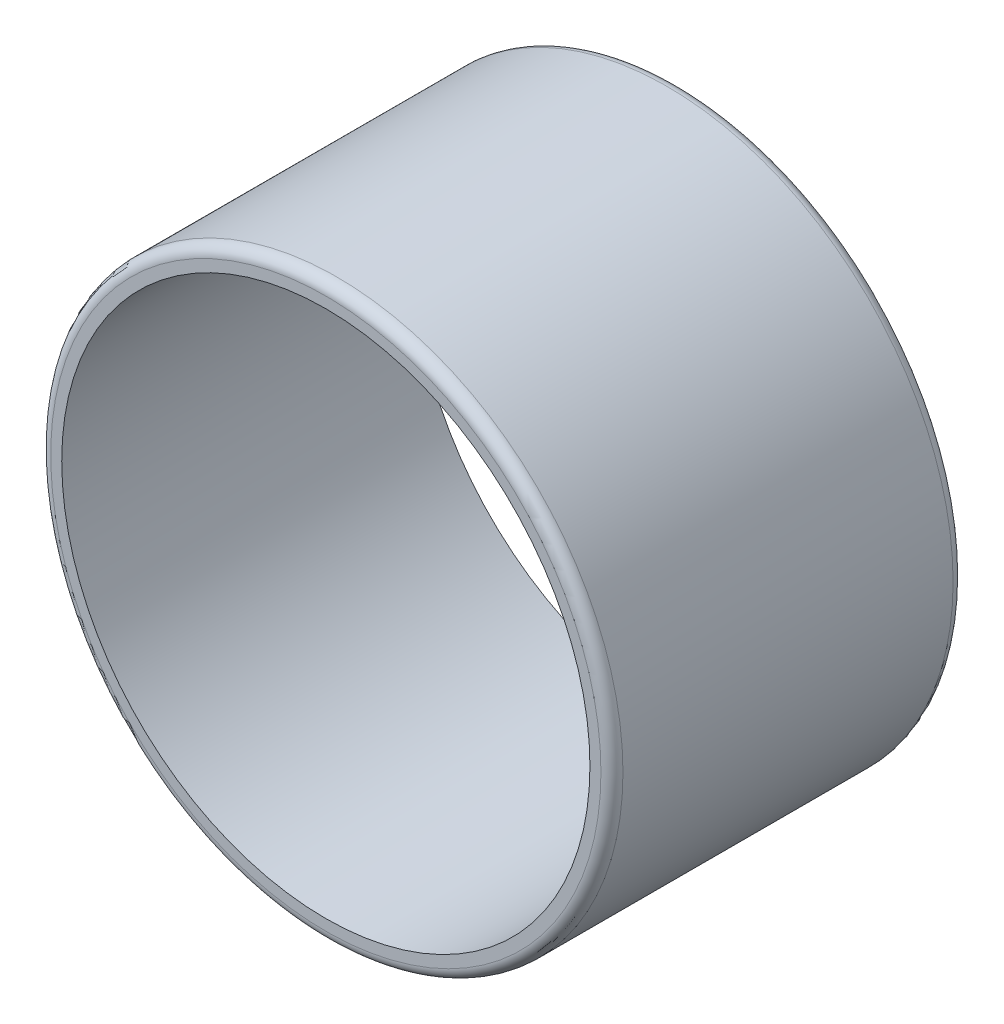
ISO-10303-21;
HEADER;
FILE_DESCRIPTION(('STEP AP214'),'2;1');
FILE_NAME('part.step','',(''),(''),'','','');
FILE_SCHEMA(('AUTOMOTIVE_DESIGN { 1 0 10303 214 1 1 1 1 }'));
ENDSEC;
DATA;
#1=APPLICATION_CONTEXT('core data for automotive mechanical design processes');
#2=APPLICATION_PROTOCOL_DEFINITION('international standard','automotive_design',2000,#1);
#3=PRODUCT_CONTEXT('',#1,'mechanical');
#4=PRODUCT('Part','Part','',(#3));
#5=PRODUCT_RELATED_PRODUCT_CATEGORY('part','',(#4));
#6=PRODUCT_DEFINITION_FORMATION('','',#4);
#7=PRODUCT_DEFINITION_CONTEXT('part definition',#1,'design');
#8=PRODUCT_DEFINITION('design','',#6,#7);
#9=PRODUCT_DEFINITION_SHAPE('','',#8);
#10=(LENGTH_UNIT() NAMED_UNIT(*) SI_UNIT(.MILLI.,.METRE.));
#11=(NAMED_UNIT(*) PLANE_ANGLE_UNIT() SI_UNIT($,.RADIAN.));
#12=(NAMED_UNIT(*) SI_UNIT($,.STERADIAN.) SOLID_ANGLE_UNIT());
#13=UNCERTAINTY_MEASURE_WITH_UNIT(LENGTH_MEASURE(1.E-05),#10,'distance_accuracy_value','');
#14=(GEOMETRIC_REPRESENTATION_CONTEXT(3) GLOBAL_UNCERTAINTY_ASSIGNED_CONTEXT((#13)) GLOBAL_UNIT_ASSIGNED_CONTEXT((#10,
#11,#12)) REPRESENTATION_CONTEXT('',''));
#15=CARTESIAN_POINT('',(0.,0.,0.));
#16=DIRECTION('',(0.,0.,1.));
#17=DIRECTION('',(1.,0.,0.));
#18=AXIS2_PLACEMENT_3D('',#15,#16,#17);
#19=CARTESIAN_POINT('',(0.,0.,8.));
#20=DIRECTION('',(0.,0.,1.));
#21=DIRECTION('',(1.,0.,0.));
#22=AXIS2_PLACEMENT_3D('',#19,#20,#21);
#23=PLANE('',#22);
#24=CARTESIAN_POINT('',(0.,0.,8.));
#25=DIRECTION('',(0.,0.,1.));
#26=DIRECTION('',(1.,0.,0.));
#27=AXIS2_PLACEMENT_3D('',#24,#25,#26);
#28=CIRCLE('',#27,12.5);
#29=CARTESIAN_POINT('',(12.5,0.,8.));
#30=VERTEX_POINT('',#29);
#31=EDGE_CURVE('E10',#30,#30,#28,.T.);
#32=ORIENTED_EDGE('',*,*,#31,.T.);
#33=EDGE_LOOP('',(#32));
#34=FACE_BOUND('',#33,.T.);
#35=CARTESIAN_POINT('',(0.,0.,8.));
#36=DIRECTION('',(0.,0.,1.));
#37=DIRECTION('',(1.,0.,0.));
#38=AXIS2_PLACEMENT_3D('',#35,#36,#37);
#39=CIRCLE('',#38,12.);
#40=CARTESIAN_POINT('',(12.,0.,8.));
#41=VERTEX_POINT('',#40);
#42=EDGE_CURVE('E51',#41,#41,#39,.T.);
#43=ORIENTED_EDGE('',*,*,#42,.F.);
#44=EDGE_LOOP('',(#43));
#45=FACE_BOUND('',#44,.T.);
#46=ADVANCED_FACE('F31',(#34,#45),#23,.T.);
#47=CARTESIAN_POINT('',(0.,0.,-8.));
#48=DIRECTION('',(0.,0.,1.));
#49=DIRECTION('',(1.,0.,0.));
#50=AXIS2_PLACEMENT_3D('',#47,#48,#49);
#51=PLANE('',#50);
#52=CARTESIAN_POINT('',(0.,0.,-8.));
#53=DIRECTION('',(0.,0.,1.));
#54=DIRECTION('',(1.,0.,0.));
#55=AXIS2_PLACEMENT_3D('',#52,#53,#54);
#56=CIRCLE('',#55,12.5);
#57=CARTESIAN_POINT('',(12.5,0.,-8.));
#58=VERTEX_POINT('',#57);
#59=EDGE_CURVE('E38',#58,#58,#56,.F.);
#60=ORIENTED_EDGE('',*,*,#59,.T.);
#61=EDGE_LOOP('',(#60));
#62=FACE_BOUND('',#61,.T.);
#63=CARTESIAN_POINT('',(0.,0.,-8.));
#64=DIRECTION('',(0.,0.,1.));
#65=DIRECTION('',(1.,0.,0.));
#66=AXIS2_PLACEMENT_3D('',#63,#64,#65);
#67=CIRCLE('',#66,12.);
#68=CARTESIAN_POINT('',(12.,0.,-8.));
#69=VERTEX_POINT('',#68);
#70=EDGE_CURVE('E52',#69,#69,#67,.T.);
#71=ORIENTED_EDGE('',*,*,#70,.T.);
#72=EDGE_LOOP('',(#71));
#73=FACE_BOUND('',#72,.T.);
#74=ADVANCED_FACE('F62',(#62,#73),#51,.F.);
#75=CARTESIAN_POINT('',(0.,0.,8.));
#76=DIRECTION('',(0.,0.,-1.));
#77=DIRECTION('',(-1.,0.,0.));
#78=AXIS2_PLACEMENT_3D('',#75,#76,#77);
#79=CYLINDRICAL_SURFACE('',#78,13.);
#80=CARTESIAN_POINT('',(0.,0.,-7.5));
#81=DIRECTION('',(0.,0.,1.));
#82=DIRECTION('',(1.,0.,0.));
#83=AXIS2_PLACEMENT_3D('',#80,#81,#82);
#84=CIRCLE('',#83,13.);
#85=CARTESIAN_POINT('',(13.,0.,-7.5));
#86=VERTEX_POINT('',#85);
#87=EDGE_CURVE('E42',#86,#86,#84,.T.);
#88=ORIENTED_EDGE('',*,*,#87,.T.);
#89=EDGE_LOOP('',(#88));
#90=FACE_BOUND('',#89,.T.);
#91=CARTESIAN_POINT('',(0.,0.,7.5));
#92=DIRECTION('',(0.,0.,1.));
#93=DIRECTION('',(1.,0.,0.));
#94=AXIS2_PLACEMENT_3D('',#91,#92,#93);
#95=CIRCLE('',#94,13.);
#96=CARTESIAN_POINT('',(13.,0.,7.5));
#97=VERTEX_POINT('',#96);
#98=EDGE_CURVE('E46',#97,#97,#95,.F.);
#99=ORIENTED_EDGE('',*,*,#98,.T.);
#100=EDGE_LOOP('',(#99));
#101=FACE_BOUND('',#100,.T.);
#102=ADVANCED_FACE('F67',(#90,#101),#79,.T.);
#103=CARTESIAN_POINT('',(0.,0.,8.));
#104=DIRECTION('',(0.,0.,-1.));
#105=DIRECTION('',(-1.,0.,0.));
#106=AXIS2_PLACEMENT_3D('',#103,#104,#105);
#107=CYLINDRICAL_SURFACE('',#106,12.);
#108=ORIENTED_EDGE('',*,*,#42,.T.);
#109=EDGE_LOOP('',(#108));
#110=FACE_BOUND('',#109,.T.);
#111=ORIENTED_EDGE('',*,*,#70,.F.);
#112=EDGE_LOOP('',(#111));
#113=FACE_BOUND('',#112,.T.);
#114=ADVANCED_FACE('F58',(#110,#113),#107,.F.);
#115=CARTESIAN_POINT('',(0.,0.,-7.5));
#116=DIRECTION('',(0.,0.,1.));
#117=DIRECTION('',(1.,0.,0.));
#118=AXIS2_PLACEMENT_3D('',#115,#116,#117);
#119=TOROIDAL_SURFACE('',#118,12.5,0.5);
#120=ORIENTED_EDGE('',*,*,#59,.F.);
#121=EDGE_LOOP('',(#120));
#122=FACE_BOUND('',#121,.T.);
#123=ORIENTED_EDGE('',*,*,#87,.F.);
#124=EDGE_LOOP('',(#123));
#125=FACE_BOUND('',#124,.T.);
#126=ADVANCED_FACE('F73',(#122,#125),#119,.T.);
#127=CARTESIAN_POINT('',(0.,0.,7.5));
#128=DIRECTION('',(0.,0.,1.));
#129=DIRECTION('',(1.,0.,0.));
#130=AXIS2_PLACEMENT_3D('',#127,#128,#129);
#131=TOROIDAL_SURFACE('',#130,12.5,0.5);
#132=ORIENTED_EDGE('',*,*,#98,.F.);
#133=EDGE_LOOP('',(#132));
#134=FACE_BOUND('',#133,.T.);
#135=ORIENTED_EDGE('',*,*,#31,.F.);
#136=EDGE_LOOP('',(#135));
#137=FACE_BOUND('',#136,.T.);
#138=ADVANCED_FACE('F33',(#134,#137),#131,.T.);
#139=CLOSED_SHELL('',(#46,#74,#102,#114,#126,#138));
#140=MANIFOLD_SOLID_BREP('B2',#139);
#141=ADVANCED_BREP_SHAPE_REPRESENTATION('',(#18,#140),#14);
#142=SHAPE_DEFINITION_REPRESENTATION(#9,#141);
ENDSEC;
END-ISO-10303-21;
